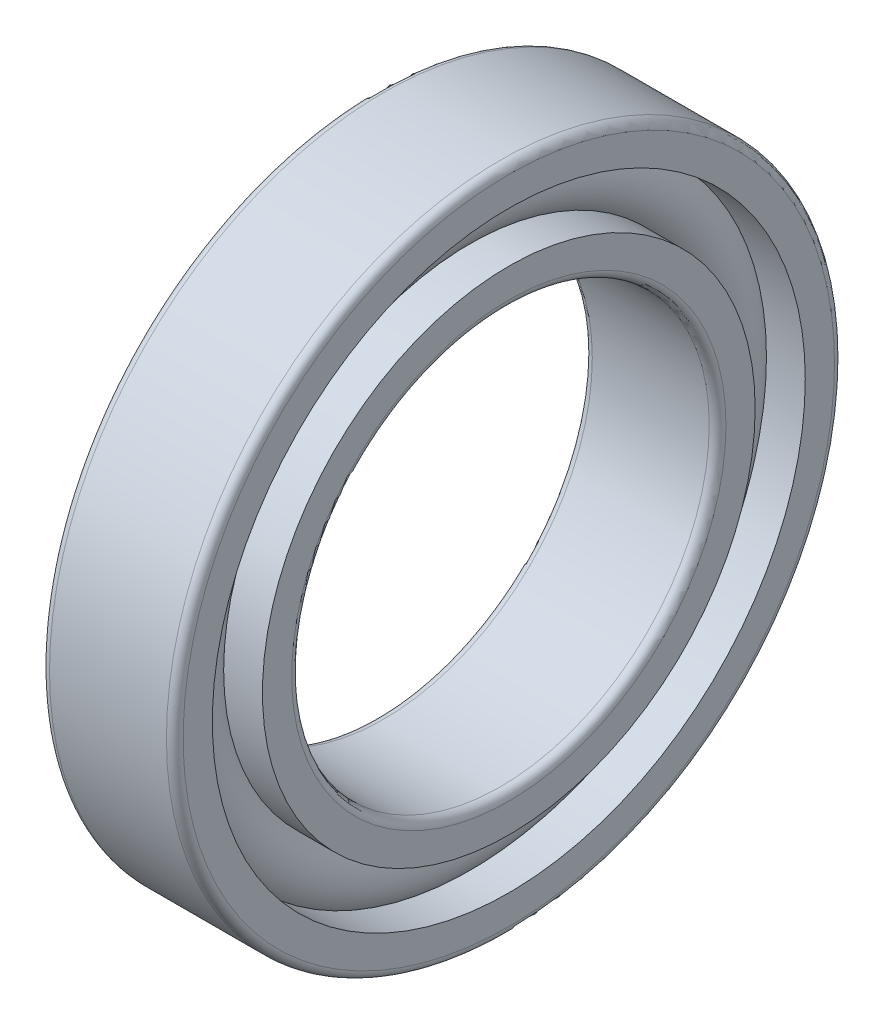
ISO-10303-21;
HEADER;
FILE_DESCRIPTION(('STEP AP214'),'2;1');
FILE_NAME('part.step','',(''),(''),'','','');
FILE_SCHEMA(('AUTOMOTIVE_DESIGN { 1 0 10303 214 1 1 1 1 }'));
ENDSEC;
DATA;
#1=APPLICATION_CONTEXT('core data for automotive mechanical design processes');
#2=APPLICATION_PROTOCOL_DEFINITION('international standard','automotive_design',2000,#1);
#3=PRODUCT_CONTEXT('',#1,'mechanical');
#4=PRODUCT('Part','Part','',(#3));
#5=PRODUCT_RELATED_PRODUCT_CATEGORY('part','',(#4));
#6=PRODUCT_DEFINITION_FORMATION('','',#4);
#7=PRODUCT_DEFINITION_CONTEXT('part definition',#1,'design');
#8=PRODUCT_DEFINITION('design','',#6,#7);
#9=PRODUCT_DEFINITION_SHAPE('','',#8);
#10=(LENGTH_UNIT() NAMED_UNIT(*) SI_UNIT(.MILLI.,.METRE.));
#11=(NAMED_UNIT(*) PLANE_ANGLE_UNIT() SI_UNIT($,.RADIAN.));
#12=(NAMED_UNIT(*) SI_UNIT($,.STERADIAN.) SOLID_ANGLE_UNIT());
#13=UNCERTAINTY_MEASURE_WITH_UNIT(LENGTH_MEASURE(1.E-05),#10,'distance_accuracy_value','');
#14=(GEOMETRIC_REPRESENTATION_CONTEXT(3) GLOBAL_UNCERTAINTY_ASSIGNED_CONTEXT((#13)) GLOBAL_UNIT_ASSIGNED_CONTEXT((#10,
#11,#12)) REPRESENTATION_CONTEXT('',''));
#15=CARTESIAN_POINT('',(0.,0.,0.));
#16=DIRECTION('',(0.,0.,1.));
#17=DIRECTION('',(1.,0.,0.));
#18=AXIS2_PLACEMENT_3D('',#15,#16,#17);
#19=CARTESIAN_POINT('',(0.,0.,0.));
#20=DIRECTION('',(-1.,0.,0.));
#21=DIRECTION('',(0.,0.,1.));
#22=AXIS2_PLACEMENT_3D('',#19,#20,#21);
#23=TOROIDAL_SURFACE('',#22,32.5,4.5);
#24=CARTESIAN_POINT('',(3.35410196624968,0.,0.));
#25=DIRECTION('',(-1.,0.,0.));
#26=DIRECTION('',(0.,0.,1.));
#27=AXIS2_PLACEMENT_3D('',#24,#25,#26);
#28=CIRCLE('',#27,35.5);
#29=CARTESIAN_POINT('',(3.35410196624968,0.,35.5));
#30=VERTEX_POINT('',#29);
#31=EDGE_CURVE('E35',#30,#30,#28,.F.);
#32=ORIENTED_EDGE('',*,*,#31,.T.);
#33=EDGE_LOOP('',(#32));
#34=FACE_BOUND('',#33,.T.);
#35=CARTESIAN_POINT('',(3.35410196624968,0.,0.));
#36=DIRECTION('',(-1.,0.,0.));
#37=DIRECTION('',(0.,0.,1.));
#38=AXIS2_PLACEMENT_3D('',#35,#36,#37);
#39=CIRCLE('',#38,29.5);
#40=CARTESIAN_POINT('',(3.35410196624968,0.,29.5));
#41=VERTEX_POINT('',#40);
#42=EDGE_CURVE('E10',#41,#41,#39,.T.);
#43=ORIENTED_EDGE('',*,*,#42,.T.);
#44=EDGE_LOOP('',(#43));
#45=FACE_BOUND('',#44,.T.);
#46=ADVANCED_FACE('F31',(#34,#45),#23,.T.);
#47=CARTESIAN_POINT('',(-20.6375,0.,0.));
#48=DIRECTION('',(1.,0.,0.));
#49=DIRECTION('',(0.,0.,-1.));
#50=AXIS2_PLACEMENT_3D('',#47,#48,#49);
#51=CYLINDRICAL_SURFACE('',#50,29.5);
#52=CARTESIAN_POINT('',(8.,0.,0.));
#53=DIRECTION('',(1.,0.,0.));
#54=DIRECTION('',(0.,0.,-1.));
#55=AXIS2_PLACEMENT_3D('',#52,#53,#54);
#56=CIRCLE('',#55,29.5);
#57=CARTESIAN_POINT('',(8.,0.,-29.5));
#58=VERTEX_POINT('',#57);
#59=EDGE_CURVE('E44',#58,#58,#56,.T.);
#60=ORIENTED_EDGE('',*,*,#59,.F.);
#61=EDGE_LOOP('',(#60));
#62=FACE_BOUND('',#61,.T.);
#63=ORIENTED_EDGE('',*,*,#42,.F.);
#64=EDGE_LOOP('',(#63));
#65=FACE_BOUND('',#64,.T.);
#66=ADVANCED_FACE('F83',(#62,#65),#51,.T.);
#67=CARTESIAN_POINT('',(-20.6375,0.,0.));
#68=DIRECTION('',(1.,0.,0.));
#69=DIRECTION('',(0.,0.,-1.));
#70=AXIS2_PLACEMENT_3D('',#67,#68,#69);
#71=CYLINDRICAL_SURFACE('',#70,29.5);
#72=CARTESIAN_POINT('',(-8.,0.,0.));
#73=DIRECTION('',(1.,0.,0.));
#74=DIRECTION('',(0.,0.,-1.));
#75=AXIS2_PLACEMENT_3D('',#72,#73,#74);
#76=CIRCLE('',#75,29.5);
#77=CARTESIAN_POINT('',(-8.,0.,-29.5));
#78=VERTEX_POINT('',#77);
#79=EDGE_CURVE('E53',#78,#78,#76,.T.);
#80=ORIENTED_EDGE('',*,*,#79,.T.);
#81=EDGE_LOOP('',(#80));
#82=FACE_BOUND('',#81,.T.);
#83=CARTESIAN_POINT('',(-3.35410196624968,0.,0.));
#84=DIRECTION('',(1.,0.,0.));
#85=DIRECTION('',(0.,0.,-1.));
#86=AXIS2_PLACEMENT_3D('',#83,#84,#85);
#87=CIRCLE('',#86,29.5);
#88=CARTESIAN_POINT('',(-3.35410196624968,0.,-29.5));
#89=VERTEX_POINT('',#88);
#90=EDGE_CURVE('E39',#89,#89,#87,.T.);
#91=ORIENTED_EDGE('',*,*,#90,.F.);
#92=EDGE_LOOP('',(#91));
#93=FACE_BOUND('',#92,.T.);
#94=ADVANCED_FACE('F86',(#82,#93),#71,.T.);
#95=CARTESIAN_POINT('',(8.,26.,0.));
#96=DIRECTION('',(1.,0.,0.));
#97=DIRECTION('',(0.,0.,-1.));
#98=AXIS2_PLACEMENT_3D('',#95,#96,#97);
#99=PLANE('',#98);
#100=ORIENTED_EDGE('',*,*,#59,.T.);
#101=EDGE_LOOP('',(#100));
#102=FACE_BOUND('',#101,.T.);
#103=CARTESIAN_POINT('',(8.,0.,0.));
#104=DIRECTION('',(1.,0.,0.));
#105=DIRECTION('',(0.,0.,-1.));
#106=AXIS2_PLACEMENT_3D('',#103,#104,#105);
#107=CIRCLE('',#106,26.);
#108=CARTESIAN_POINT('',(8.,0.,-26.));
#109=VERTEX_POINT('',#108);
#110=EDGE_CURVE('E75',#109,#109,#107,.T.);
#111=ORIENTED_EDGE('',*,*,#110,.F.);
#112=EDGE_LOOP('',(#111));
#113=FACE_BOUND('',#112,.T.);
#114=ADVANCED_FACE('F80',(#102,#113),#99,.T.);
#115=CARTESIAN_POINT('',(7.,0.,0.));
#116=DIRECTION('',(1.,0.,0.));
#117=DIRECTION('',(0.,0.,-1.));
#118=AXIS2_PLACEMENT_3D('',#115,#116,#117);
#119=TOROIDAL_SURFACE('',#118,26.,1.);
#120=ORIENTED_EDGE('',*,*,#110,.T.);
#121=EDGE_LOOP('',(#120));
#122=FACE_BOUND('',#121,.T.);
#123=CARTESIAN_POINT('',(7.,0.,0.));
#124=DIRECTION('',(1.,0.,0.));
#125=DIRECTION('',(0.,0.,-1.));
#126=AXIS2_PLACEMENT_3D('',#123,#124,#125);
#127=CIRCLE('',#126,25.);
#128=CARTESIAN_POINT('',(7.,0.,-25.));
#129=VERTEX_POINT('',#128);
#130=EDGE_CURVE('E72',#129,#129,#127,.T.);
#131=ORIENTED_EDGE('',*,*,#130,.F.);
#132=EDGE_LOOP('',(#131));
#133=FACE_BOUND('',#132,.T.);
#134=ADVANCED_FACE('F97',(#122,#133),#119,.T.);
#135=CARTESIAN_POINT('',(-20.6375,0.,0.));
#136=DIRECTION('',(1.,0.,0.));
#137=DIRECTION('',(0.,0.,-1.));
#138=AXIS2_PLACEMENT_3D('',#135,#136,#137);
#139=CYLINDRICAL_SURFACE('',#138,25.);
#140=ORIENTED_EDGE('',*,*,#130,.T.);
#141=EDGE_LOOP('',(#140));
#142=FACE_BOUND('',#141,.T.);
#143=CARTESIAN_POINT('',(-7.,0.,0.));
#144=DIRECTION('',(1.,0.,0.));
#145=DIRECTION('',(0.,0.,-1.));
#146=AXIS2_PLACEMENT_3D('',#143,#144,#145);
#147=CIRCLE('',#146,25.);
#148=CARTESIAN_POINT('',(-7.,0.,-25.));
#149=VERTEX_POINT('',#148);
#150=EDGE_CURVE('E69',#149,#149,#147,.T.);
#151=ORIENTED_EDGE('',*,*,#150,.F.);
#152=EDGE_LOOP('',(#151));
#153=FACE_BOUND('',#152,.T.);
#154=ADVANCED_FACE('F100',(#142,#153),#139,.F.);
#155=CARTESIAN_POINT('',(-7.,0.,0.));
#156=DIRECTION('',(1.,0.,0.));
#157=DIRECTION('',(0.,0.,-1.));
#158=AXIS2_PLACEMENT_3D('',#155,#156,#157);
#159=TOROIDAL_SURFACE('',#158,26.,1.);
#160=ORIENTED_EDGE('',*,*,#150,.T.);
#161=EDGE_LOOP('',(#160));
#162=FACE_BOUND('',#161,.T.);
#163=CARTESIAN_POINT('',(-8.,0.,0.));
#164=DIRECTION('',(1.,0.,0.));
#165=DIRECTION('',(0.,0.,-1.));
#166=AXIS2_PLACEMENT_3D('',#163,#164,#165);
#167=CIRCLE('',#166,26.);
#168=CARTESIAN_POINT('',(-8.,0.,-26.));
#169=VERTEX_POINT('',#168);
#170=EDGE_CURVE('E66',#169,#169,#167,.T.);
#171=ORIENTED_EDGE('',*,*,#170,.F.);
#172=EDGE_LOOP('',(#171));
#173=FACE_BOUND('',#172,.T.);
#174=ADVANCED_FACE('F104',(#162,#173),#159,.T.);
#175=CARTESIAN_POINT('',(-8.,29.5,0.));
#176=DIRECTION('',(-1.,0.,0.));
#177=DIRECTION('',(0.,0.,1.));
#178=AXIS2_PLACEMENT_3D('',#175,#176,#177);
#179=PLANE('',#178);
#180=ORIENTED_EDGE('',*,*,#170,.T.);
#181=EDGE_LOOP('',(#180));
#182=FACE_BOUND('',#181,.T.);
#183=ORIENTED_EDGE('',*,*,#79,.F.);
#184=EDGE_LOOP('',(#183));
#185=FACE_BOUND('',#184,.T.);
#186=ADVANCED_FACE('F108',(#182,#185),#179,.T.);
#187=CARTESIAN_POINT('',(-3.35410196624968,0.,0.));
#188=DIRECTION('',(1.,0.,0.));
#189=DIRECTION('',(0.,0.,-1.));
#190=AXIS2_PLACEMENT_3D('',#187,#188,#189);
#191=CIRCLE('',#190,35.5);
#192=CARTESIAN_POINT('',(-3.35410196624968,0.,-35.5));
#193=VERTEX_POINT('',#192);
#194=EDGE_CURVE('E47',#193,#193,#191,.F.);
#195=ORIENTED_EDGE('',*,*,#194,.T.);
#196=EDGE_LOOP('',(#195));
#197=FACE_BOUND('',#196,.T.);
#198=ORIENTED_EDGE('',*,*,#90,.T.);
#199=EDGE_LOOP('',(#198));
#200=FACE_BOUND('',#199,.T.);
#201=ADVANCED_FACE('F33',(#197,#200),#23,.T.);
#202=CARTESIAN_POINT('',(-20.6375,0.,0.));
#203=DIRECTION('',(1.,0.,0.));
#204=DIRECTION('',(0.,0.,-1.));
#205=AXIS2_PLACEMENT_3D('',#202,#203,#204);
#206=CYLINDRICAL_SURFACE('',#205,35.5);
#207=CARTESIAN_POINT('',(7.99999999999999,0.,0.));
#208=DIRECTION('',(1.,0.,0.));
#209=DIRECTION('',(0.,0.,-1.));
#210=AXIS2_PLACEMENT_3D('',#207,#208,#209);
#211=CIRCLE('',#210,35.5);
#212=CARTESIAN_POINT('',(7.99999999999999,0.,-35.5));
#213=VERTEX_POINT('',#212);
#214=EDGE_CURVE('E49',#213,#213,#211,.T.);
#215=ORIENTED_EDGE('',*,*,#214,.T.);
#216=EDGE_LOOP('',(#215));
#217=FACE_BOUND('',#216,.T.);
#218=ORIENTED_EDGE('',*,*,#31,.F.);
#219=EDGE_LOOP('',(#218));
#220=FACE_BOUND('',#219,.T.);
#221=ADVANCED_FACE('F113',(#217,#220),#206,.F.);
#222=CARTESIAN_POINT('',(-20.6375,0.,0.));
#223=DIRECTION('',(1.,0.,0.));
#224=DIRECTION('',(0.,0.,-1.));
#225=AXIS2_PLACEMENT_3D('',#222,#223,#224);
#226=CYLINDRICAL_SURFACE('',#225,35.5);
#227=CARTESIAN_POINT('',(-7.99999999999999,0.,0.));
#228=DIRECTION('',(1.,0.,0.));
#229=DIRECTION('',(0.,0.,-1.));
#230=AXIS2_PLACEMENT_3D('',#227,#228,#229);
#231=CIRCLE('',#230,35.5);
#232=CARTESIAN_POINT('',(-7.99999999999999,0.,-35.5));
#233=VERTEX_POINT('',#232);
#234=EDGE_CURVE('E144',#233,#233,#231,.T.);
#235=ORIENTED_EDGE('',*,*,#234,.F.);
#236=EDGE_LOOP('',(#235));
#237=FACE_BOUND('',#236,.T.);
#238=ORIENTED_EDGE('',*,*,#194,.F.);
#239=EDGE_LOOP('',(#238));
#240=FACE_BOUND('',#239,.T.);
#241=ADVANCED_FACE('F116',(#237,#240),#226,.F.);
#242=CARTESIAN_POINT('',(8.,39.,0.));
#243=DIRECTION('',(1.,0.,0.));
#244=DIRECTION('',(0.,0.,-1.));
#245=AXIS2_PLACEMENT_3D('',#242,#243,#244);
#246=PLANE('',#245);
#247=CARTESIAN_POINT('',(8.,0.,0.));
#248=DIRECTION('',(1.,0.,0.));
#249=DIRECTION('',(0.,0.,-1.));
#250=AXIS2_PLACEMENT_3D('',#247,#248,#249);
#251=CIRCLE('',#250,39.);
#252=CARTESIAN_POINT('',(8.,0.,-39.));
#253=VERTEX_POINT('',#252);
#254=EDGE_CURVE('E55',#253,#253,#251,.T.);
#255=ORIENTED_EDGE('',*,*,#254,.T.);
#256=EDGE_LOOP('',(#255));
#257=FACE_BOUND('',#256,.T.);
#258=ORIENTED_EDGE('',*,*,#214,.F.);
#259=EDGE_LOOP('',(#258));
#260=FACE_BOUND('',#259,.T.);
#261=ADVANCED_FACE('F117',(#257,#260),#246,.T.);
#262=CARTESIAN_POINT('',(7.,0.,0.));
#263=DIRECTION('',(1.,0.,0.));
#264=DIRECTION('',(0.,0.,-1.));
#265=AXIS2_PLACEMENT_3D('',#262,#263,#264);
#266=TOROIDAL_SURFACE('',#265,39.,1.);
#267=CARTESIAN_POINT('',(7.,0.,0.));
#268=DIRECTION('',(1.,0.,0.));
#269=DIRECTION('',(0.,0.,-1.));
#270=AXIS2_PLACEMENT_3D('',#267,#268,#269);
#271=CIRCLE('',#270,40.);
#272=CARTESIAN_POINT('',(7.,0.,-40.));
#273=VERTEX_POINT('',#272);
#274=EDGE_CURVE('E60',#273,#273,#271,.T.);
#275=ORIENTED_EDGE('',*,*,#274,.T.);
#276=EDGE_LOOP('',(#275));
#277=FACE_BOUND('',#276,.T.);
#278=ORIENTED_EDGE('',*,*,#254,.F.);
#279=EDGE_LOOP('',(#278));
#280=FACE_BOUND('',#279,.T.);
#281=ADVANCED_FACE('F120',(#277,#280),#266,.T.);
#282=CARTESIAN_POINT('',(-20.6375,0.,0.));
#283=DIRECTION('',(1.,0.,0.));
#284=DIRECTION('',(0.,0.,-1.));
#285=AXIS2_PLACEMENT_3D('',#282,#283,#284);
#286=CYLINDRICAL_SURFACE('',#285,40.);
#287=CARTESIAN_POINT('',(-7.,0.,0.));
#288=DIRECTION('',(1.,0.,0.));
#289=DIRECTION('',(0.,0.,-1.));
#290=AXIS2_PLACEMENT_3D('',#287,#288,#289);
#291=CIRCLE('',#290,40.);
#292=CARTESIAN_POINT('',(-7.,0.,-40.));
#293=VERTEX_POINT('',#292);
#294=EDGE_CURVE('E148',#293,#293,#291,.T.);
#295=ORIENTED_EDGE('',*,*,#294,.T.);
#296=EDGE_LOOP('',(#295));
#297=FACE_BOUND('',#296,.T.);
#298=ORIENTED_EDGE('',*,*,#274,.F.);
#299=EDGE_LOOP('',(#298));
#300=FACE_BOUND('',#299,.T.);
#301=ADVANCED_FACE('F124',(#297,#300),#286,.T.);
#302=CARTESIAN_POINT('',(-7.,0.,0.));
#303=DIRECTION('',(1.,0.,0.));
#304=DIRECTION('',(0.,0.,-1.));
#305=AXIS2_PLACEMENT_3D('',#302,#303,#304);
#306=TOROIDAL_SURFACE('',#305,39.,1.);
#307=CARTESIAN_POINT('',(-7.99999999999999,0.,0.));
#308=DIRECTION('',(1.,0.,0.));
#309=DIRECTION('',(0.,0.,-1.));
#310=AXIS2_PLACEMENT_3D('',#307,#308,#309);
#311=CIRCLE('',#310,39.);
#312=CARTESIAN_POINT('',(-7.99999999999999,0.,-39.));
#313=VERTEX_POINT('',#312);
#314=EDGE_CURVE('E145',#313,#313,#311,.T.);
#315=ORIENTED_EDGE('',*,*,#314,.T.);
#316=EDGE_LOOP('',(#315));
#317=FACE_BOUND('',#316,.T.);
#318=ORIENTED_EDGE('',*,*,#294,.F.);
#319=EDGE_LOOP('',(#318));
#320=FACE_BOUND('',#319,.T.);
#321=ADVANCED_FACE('F128',(#317,#320),#306,.T.);
#322=CARTESIAN_POINT('',(-7.99999999999999,35.5,0.));
#323=DIRECTION('',(-1.,0.,0.));
#324=DIRECTION('',(0.,0.,1.));
#325=AXIS2_PLACEMENT_3D('',#322,#323,#324);
#326=PLANE('',#325);
#327=ORIENTED_EDGE('',*,*,#234,.T.);
#328=EDGE_LOOP('',(#327));
#329=FACE_BOUND('',#328,.T.);
#330=ORIENTED_EDGE('',*,*,#314,.F.);
#331=EDGE_LOOP('',(#330));
#332=FACE_BOUND('',#331,.T.);
#333=ADVANCED_FACE('F132',(#329,#332),#326,.T.);
#334=CLOSED_SHELL('',(#46,#66,#94,#114,#134,#154,#174,#186,#201,#221,#241,#261,#281,#301,#321,#333));
#335=MANIFOLD_SOLID_BREP('B2',#334);
#336=ADVANCED_BREP_SHAPE_REPRESENTATION('',(#18,#335),#14);
#337=SHAPE_DEFINITION_REPRESENTATION(#9,#336);
ENDSEC;
END-ISO-10303-21;
